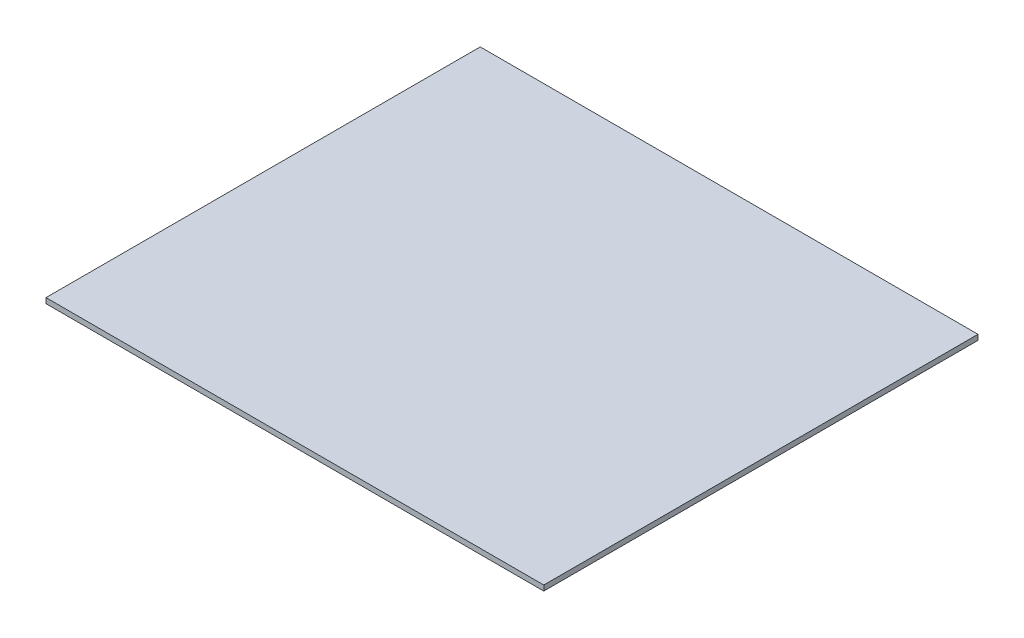
ISO-10303-21;
HEADER;
FILE_DESCRIPTION(('STEP AP214'),'2;1');
FILE_NAME('part.step','',(''),(''),'','','');
FILE_SCHEMA(('AUTOMOTIVE_DESIGN { 1 0 10303 214 1 1 1 1 }'));
ENDSEC;
DATA;
#1=APPLICATION_CONTEXT('core data for automotive mechanical design processes');
#2=APPLICATION_PROTOCOL_DEFINITION('international standard','automotive_design',2000,#1);
#3=PRODUCT_CONTEXT('',#1,'mechanical');
#4=PRODUCT('Part','Part','',(#3));
#5=PRODUCT_RELATED_PRODUCT_CATEGORY('part','',(#4));
#6=PRODUCT_DEFINITION_FORMATION('','',#4);
#7=PRODUCT_DEFINITION_CONTEXT('part definition',#1,'design');
#8=PRODUCT_DEFINITION('design','',#6,#7);
#9=PRODUCT_DEFINITION_SHAPE('','',#8);
#10=(LENGTH_UNIT() NAMED_UNIT(*) SI_UNIT(.MILLI.,.METRE.));
#11=(NAMED_UNIT(*) PLANE_ANGLE_UNIT() SI_UNIT($,.RADIAN.));
#12=(NAMED_UNIT(*) SI_UNIT($,.STERADIAN.) SOLID_ANGLE_UNIT());
#13=UNCERTAINTY_MEASURE_WITH_UNIT(LENGTH_MEASURE(1.E-05),#10,'distance_accuracy_value','');
#14=(GEOMETRIC_REPRESENTATION_CONTEXT(3) GLOBAL_UNCERTAINTY_ASSIGNED_CONTEXT((#13)) GLOBAL_UNIT_ASSIGNED_CONTEXT((#10,
#11,#12)) REPRESENTATION_CONTEXT('',''));
#15=CARTESIAN_POINT('',(0.,0.,0.));
#16=DIRECTION('',(0.,0.,1.));
#17=DIRECTION('',(1.,0.,0.));
#18=AXIS2_PLACEMENT_3D('',#15,#16,#17);
#19=CARTESIAN_POINT('',(-17.3059490084987,6.35,-509.8111898017));
#20=DIRECTION('',(1.,0.,0.));
#21=DIRECTION('',(0.,0.,-1.));
#22=AXIS2_PLACEMENT_3D('',#19,#20,#21);
#23=PLANE('',#22);
#24=DIRECTION('',(0.,0.,1.));
#25=VECTOR('',#24,1.);
#26=CARTESIAN_POINT('',(-17.3059490084987,0.,-509.8111898017));
#27=LINE('',#26,#25);
#28=CARTESIAN_POINT('',(-17.3059490084987,0.,-509.8111898017));
#29=VERTEX_POINT('',#28);
#30=CARTESIAN_POINT('',(-17.3059490084986,0.,10.8888101983003));
#31=VERTEX_POINT('',#30);
#32=EDGE_CURVE('E96',#29,#31,#27,.T.);
#33=ORIENTED_EDGE('',*,*,#32,.T.);
#34=DIRECTION('',(0.,-1.,0.));
#35=VECTOR('',#34,1.);
#36=CARTESIAN_POINT('',(-17.3059490084986,6.35,10.8888101983003));
#37=LINE('',#36,#35);
#38=CARTESIAN_POINT('',(-17.3059490084986,6.35,10.8888101983003));
#39=VERTEX_POINT('',#38);
#40=EDGE_CURVE('E11',#39,#31,#37,.T.);
#41=ORIENTED_EDGE('',*,*,#40,.F.);
#42=DIRECTION('',(0.,0.,1.));
#43=VECTOR('',#42,1.);
#44=CARTESIAN_POINT('',(-17.3059490084987,6.35,-509.8111898017));
#45=LINE('',#44,#43);
#46=CARTESIAN_POINT('',(-17.3059490084987,6.35,-509.8111898017));
#47=VERTEX_POINT('',#46);
#48=EDGE_CURVE('E84',#47,#39,#45,.T.);
#49=ORIENTED_EDGE('',*,*,#48,.F.);
#50=DIRECTION('',(0.,-1.,0.));
#51=VECTOR('',#50,1.);
#52=CARTESIAN_POINT('',(-17.3059490084987,6.35,-509.8111898017));
#53=LINE('',#52,#51);
#54=EDGE_CURVE('E92',#47,#29,#53,.T.);
#55=ORIENTED_EDGE('',*,*,#54,.T.);
#56=EDGE_LOOP('',(#33,#41,#49,#55));
#57=FACE_BOUND('',#56,.T.);
#58=ADVANCED_FACE('F33',(#57),#23,.F.);
#59=CARTESIAN_POINT('',(-17.3059490084986,6.35,10.8888101983003));
#60=DIRECTION('',(0.,0.,-1.));
#61=DIRECTION('',(-1.,0.,0.));
#62=AXIS2_PLACEMENT_3D('',#59,#60,#61);
#63=PLANE('',#62);
#64=DIRECTION('',(1.,0.,0.));
#65=VECTOR('',#64,1.);
#66=CARTESIAN_POINT('',(-17.3059490084986,0.,10.8888101983003));
#67=LINE('',#66,#65);
#68=CARTESIAN_POINT('',(579.594050991501,0.,10.8888101983003));
#69=VERTEX_POINT('',#68);
#70=EDGE_CURVE('E88',#31,#69,#67,.T.);
#71=ORIENTED_EDGE('',*,*,#70,.T.);
#72=DIRECTION('',(0.,-1.,0.));
#73=VECTOR('',#72,1.);
#74=CARTESIAN_POINT('',(579.594050991501,6.35,10.8888101983003));
#75=LINE('',#74,#73);
#76=CARTESIAN_POINT('',(579.594050991501,6.35,10.8888101983003));
#77=VERTEX_POINT('',#76);
#78=EDGE_CURVE('E41',#77,#69,#75,.T.);
#79=ORIENTED_EDGE('',*,*,#78,.F.);
#80=DIRECTION('',(1.,0.,0.));
#81=VECTOR('',#80,1.);
#82=CARTESIAN_POINT('',(-17.3059490084986,6.35,10.8888101983003));
#83=LINE('',#82,#81);
#84=EDGE_CURVE('E79',#39,#77,#83,.T.);
#85=ORIENTED_EDGE('',*,*,#84,.F.);
#86=ORIENTED_EDGE('',*,*,#40,.T.);
#87=EDGE_LOOP('',(#71,#79,#85,#86));
#88=FACE_BOUND('',#87,.T.);
#89=ADVANCED_FACE('F87',(#88),#63,.F.);
#90=CARTESIAN_POINT('',(579.594050991501,6.35,-509.8111898017));
#91=DIRECTION('',(-1.,0.,0.));
#92=DIRECTION('',(0.,0.,1.));
#93=AXIS2_PLACEMENT_3D('',#90,#91,#92);
#94=PLANE('',#93);
#95=DIRECTION('',(0.,0.,-1.));
#96=VECTOR('',#95,1.);
#97=CARTESIAN_POINT('',(579.594050991501,0.,-509.8111898017));
#98=LINE('',#97,#96);
#99=CARTESIAN_POINT('',(579.594050991501,0.,-509.8111898017));
#100=VERTEX_POINT('',#99);
#101=EDGE_CURVE('E66',#69,#100,#98,.T.);
#102=ORIENTED_EDGE('',*,*,#101,.T.);
#103=DIRECTION('',(0.,-1.,0.));
#104=VECTOR('',#103,1.);
#105=CARTESIAN_POINT('',(579.594050991501,6.35,-509.8111898017));
#106=LINE('',#105,#104);
#107=CARTESIAN_POINT('',(579.594050991501,6.35,-509.8111898017));
#108=VERTEX_POINT('',#107);
#109=EDGE_CURVE('E89',#108,#100,#106,.T.);
#110=ORIENTED_EDGE('',*,*,#109,.F.);
#111=DIRECTION('',(0.,0.,-1.));
#112=VECTOR('',#111,1.);
#113=CARTESIAN_POINT('',(579.594050991501,6.35,-509.8111898017));
#114=LINE('',#113,#112);
#115=EDGE_CURVE('E82',#77,#108,#114,.T.);
#116=ORIENTED_EDGE('',*,*,#115,.F.);
#117=ORIENTED_EDGE('',*,*,#78,.T.);
#118=EDGE_LOOP('',(#102,#110,#116,#117));
#119=FACE_BOUND('',#118,.T.);
#120=ADVANCED_FACE('F90',(#119),#94,.F.);
#121=CARTESIAN_POINT('',(-17.3059490084987,6.35,-509.8111898017));
#122=DIRECTION('',(0.,0.,1.));
#123=DIRECTION('',(1.,0.,0.));
#124=AXIS2_PLACEMENT_3D('',#121,#122,#123);
#125=PLANE('',#124);
#126=DIRECTION('',(-1.,0.,0.));
#127=VECTOR('',#126,1.);
#128=CARTESIAN_POINT('',(-17.3059490084987,0.,-509.8111898017));
#129=LINE('',#128,#127);
#130=EDGE_CURVE('E72',#100,#29,#129,.T.);
#131=ORIENTED_EDGE('',*,*,#130,.T.);
#132=ORIENTED_EDGE('',*,*,#54,.F.);
#133=DIRECTION('',(-1.,0.,0.));
#134=VECTOR('',#133,1.);
#135=CARTESIAN_POINT('',(-17.3059490084987,6.35,-509.8111898017));
#136=LINE('',#135,#134);
#137=EDGE_CURVE('E49',#108,#47,#136,.T.);
#138=ORIENTED_EDGE('',*,*,#137,.F.);
#139=ORIENTED_EDGE('',*,*,#109,.T.);
#140=EDGE_LOOP('',(#131,#132,#138,#139));
#141=FACE_BOUND('',#140,.T.);
#142=ADVANCED_FACE('F103',(#141),#125,.F.);
#143=CARTESIAN_POINT('',(0.,6.35,0.));
#144=DIRECTION('',(0.,1.,0.));
#145=DIRECTION('',(0.,0.,1.));
#146=AXIS2_PLACEMENT_3D('',#143,#144,#145);
#147=PLANE('',#146);
#148=ORIENTED_EDGE('',*,*,#48,.T.);
#149=ORIENTED_EDGE('',*,*,#84,.T.);
#150=ORIENTED_EDGE('',*,*,#115,.T.);
#151=ORIENTED_EDGE('',*,*,#137,.T.);
#152=EDGE_LOOP('',(#148,#149,#150,#151));
#153=FACE_BOUND('',#152,.T.);
#154=ADVANCED_FACE('F80',(#153),#147,.T.);
#155=CARTESIAN_POINT('',(0.,0.,0.));
#156=DIRECTION('',(0.,1.,0.));
#157=DIRECTION('',(0.,0.,1.));
#158=AXIS2_PLACEMENT_3D('',#155,#156,#157);
#159=PLANE('',#158);
#160=ORIENTED_EDGE('',*,*,#32,.F.);
#161=ORIENTED_EDGE('',*,*,#130,.F.);
#162=ORIENTED_EDGE('',*,*,#101,.F.);
#163=ORIENTED_EDGE('',*,*,#70,.F.);
#164=EDGE_LOOP('',(#160,#161,#162,#163));
#165=FACE_BOUND('',#164,.T.);
#166=ADVANCED_FACE('F106',(#165),#159,.F.);
#167=CLOSED_SHELL('',(#58,#89,#120,#142,#154,#166));
#168=MANIFOLD_SOLID_BREP('B2',#167);
#169=ADVANCED_BREP_SHAPE_REPRESENTATION('',(#18,#168),#14);
#170=SHAPE_DEFINITION_REPRESENTATION(#9,#169);
ENDSEC;
END-ISO-10303-21;
